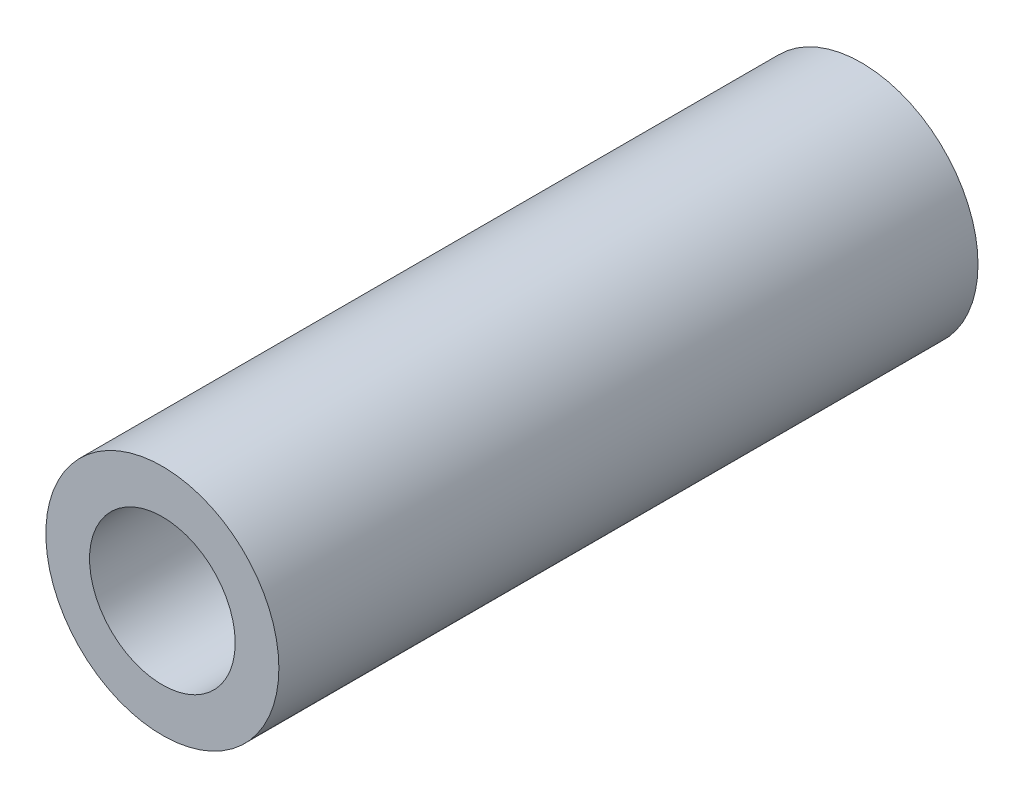
ISO-10303-21;
HEADER;
FILE_DESCRIPTION(('STEP AP214'),'2;1');
FILE_NAME('part.step','',(''),(''),'','','');
FILE_SCHEMA(('AUTOMOTIVE_DESIGN { 1 0 10303 214 1 1 1 1 }'));
ENDSEC;
DATA;
#1=APPLICATION_CONTEXT('core data for automotive mechanical design processes');
#2=APPLICATION_PROTOCOL_DEFINITION('international standard','automotive_design',2000,#1);
#3=PRODUCT_CONTEXT('',#1,'mechanical');
#4=PRODUCT('Part','Part','',(#3));
#5=PRODUCT_RELATED_PRODUCT_CATEGORY('part','',(#4));
#6=PRODUCT_DEFINITION_FORMATION('','',#4);
#7=PRODUCT_DEFINITION_CONTEXT('part definition',#1,'design');
#8=PRODUCT_DEFINITION('design','',#6,#7);
#9=PRODUCT_DEFINITION_SHAPE('','',#8);
#10=(LENGTH_UNIT() NAMED_UNIT(*) SI_UNIT(.MILLI.,.METRE.));
#11=(NAMED_UNIT(*) PLANE_ANGLE_UNIT() SI_UNIT($,.RADIAN.));
#12=(NAMED_UNIT(*) SI_UNIT($,.STERADIAN.) SOLID_ANGLE_UNIT());
#13=UNCERTAINTY_MEASURE_WITH_UNIT(LENGTH_MEASURE(1.E-05),#10,'distance_accuracy_value','');
#14=(GEOMETRIC_REPRESENTATION_CONTEXT(3) GLOBAL_UNCERTAINTY_ASSIGNED_CONTEXT((#13)) GLOBAL_UNIT_ASSIGNED_CONTEXT((#10,
#11,#12)) REPRESENTATION_CONTEXT('',''));
#15=CARTESIAN_POINT('',(0.,0.,0.));
#16=DIRECTION('',(0.,0.,1.));
#17=DIRECTION('',(1.,0.,0.));
#18=AXIS2_PLACEMENT_3D('',#15,#16,#17);
#19=CARTESIAN_POINT('',(0.,0.,12.));
#20=DIRECTION('',(0.,0.,-1.));
#21=DIRECTION('',(-1.,0.,0.));
#22=AXIS2_PLACEMENT_3D('',#19,#20,#21);
#23=CYLINDRICAL_SURFACE('',#22,2.);
#24=CARTESIAN_POINT('',(0.,0.,12.));
#25=DIRECTION('',(0.,0.,1.));
#26=DIRECTION('',(1.,0.,0.));
#27=AXIS2_PLACEMENT_3D('',#24,#25,#26);
#28=CIRCLE('',#27,2.);
#29=CARTESIAN_POINT('',(2.,0.,12.));
#30=VERTEX_POINT('',#29);
#31=EDGE_CURVE('E10',#30,#30,#28,.T.);
#32=ORIENTED_EDGE('',*,*,#31,.F.);
#33=EDGE_LOOP('',(#32));
#34=FACE_BOUND('',#33,.T.);
#35=CARTESIAN_POINT('',(0.,0.,0.));
#36=DIRECTION('',(0.,0.,1.));
#37=DIRECTION('',(1.,0.,0.));
#38=AXIS2_PLACEMENT_3D('',#35,#36,#37);
#39=CIRCLE('',#38,2.);
#40=CARTESIAN_POINT('',(2.,0.,0.));
#41=VERTEX_POINT('',#40);
#42=EDGE_CURVE('E37',#41,#41,#39,.T.);
#43=ORIENTED_EDGE('',*,*,#42,.T.);
#44=EDGE_LOOP('',(#43));
#45=FACE_BOUND('',#44,.T.);
#46=ADVANCED_FACE('F34',(#34,#45),#23,.T.);
#47=CARTESIAN_POINT('',(0.,0.,12.));
#48=DIRECTION('',(0.,0.,1.));
#49=DIRECTION('',(1.,0.,0.));
#50=AXIS2_PLACEMENT_3D('',#47,#48,#49);
#51=PLANE('',#50);
#52=CARTESIAN_POINT('',(0.,0.,12.));
#53=DIRECTION('',(0.,0.,1.));
#54=DIRECTION('',(1.,0.,0.));
#55=AXIS2_PLACEMENT_3D('',#52,#53,#54);
#56=CIRCLE('',#55,1.25);
#57=CARTESIAN_POINT('',(1.25,0.,12.));
#58=VERTEX_POINT('',#57);
#59=EDGE_CURVE('E48',#58,#58,#56,.T.);
#60=ORIENTED_EDGE('',*,*,#59,.F.);
#61=EDGE_LOOP('',(#60));
#62=FACE_BOUND('',#61,.T.);
#63=ORIENTED_EDGE('',*,*,#31,.T.);
#64=EDGE_LOOP('',(#63));
#65=FACE_BOUND('',#64,.T.);
#66=ADVANCED_FACE('F54',(#62,#65),#51,.T.);
#67=CARTESIAN_POINT('',(0.,0.,0.));
#68=DIRECTION('',(0.,0.,1.));
#69=DIRECTION('',(1.,0.,0.));
#70=AXIS2_PLACEMENT_3D('',#67,#68,#69);
#71=PLANE('',#70);
#72=CARTESIAN_POINT('',(0.,0.,0.));
#73=DIRECTION('',(0.,0.,1.));
#74=DIRECTION('',(1.,0.,0.));
#75=AXIS2_PLACEMENT_3D('',#72,#73,#74);
#76=CIRCLE('',#75,1.25);
#77=CARTESIAN_POINT('',(1.25,0.,0.));
#78=VERTEX_POINT('',#77);
#79=EDGE_CURVE('E44',#78,#78,#76,.T.);
#80=ORIENTED_EDGE('',*,*,#79,.T.);
#81=EDGE_LOOP('',(#80));
#82=FACE_BOUND('',#81,.T.);
#83=ORIENTED_EDGE('',*,*,#42,.F.);
#84=EDGE_LOOP('',(#83));
#85=FACE_BOUND('',#84,.T.);
#86=ADVANCED_FACE('F56',(#82,#85),#71,.F.);
#87=CARTESIAN_POINT('',(0.,0.,12.));
#88=DIRECTION('',(0.,0.,1.));
#89=DIRECTION('',(1.,0.,0.));
#90=AXIS2_PLACEMENT_3D('',#87,#88,#89);
#91=CYLINDRICAL_SURFACE('',#90,1.25);
#92=ORIENTED_EDGE('',*,*,#79,.F.);
#93=EDGE_LOOP('',(#92));
#94=FACE_BOUND('',#93,.T.);
#95=ORIENTED_EDGE('',*,*,#59,.T.);
#96=EDGE_LOOP('',(#95));
#97=FACE_BOUND('',#96,.T.);
#98=ADVANCED_FACE('F52',(#94,#97),#91,.F.);
#99=CLOSED_SHELL('',(#46,#66,#86,#98));
#100=MANIFOLD_SOLID_BREP('B2',#99);
#101=ADVANCED_BREP_SHAPE_REPRESENTATION('',(#18,#100),#14);
#102=SHAPE_DEFINITION_REPRESENTATION(#9,#101);
ENDSEC;
END-ISO-10303-21;
